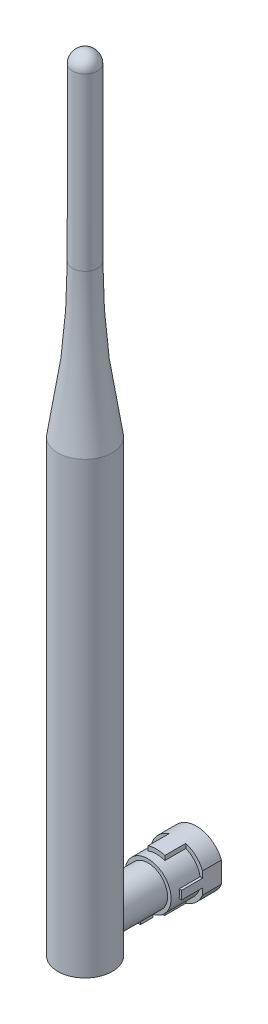
ISO-10303-21;
HEADER;
FILE_DESCRIPTION(('STEP AP214'),'2;1');
FILE_NAME('part.step','',(''),(''),'','','');
FILE_SCHEMA(('AUTOMOTIVE_DESIGN { 1 0 10303 214 1 1 1 1 }'));
ENDSEC;
DATA;
#1=APPLICATION_CONTEXT('core data for automotive mechanical design processes');
#2=APPLICATION_PROTOCOL_DEFINITION('international standard','automotive_design',2000,#1);
#3=PRODUCT_CONTEXT('',#1,'mechanical');
#4=PRODUCT('Part','Part','',(#3));
#5=PRODUCT_RELATED_PRODUCT_CATEGORY('part','',(#4));
#6=PRODUCT_DEFINITION_FORMATION('','',#4);
#7=PRODUCT_DEFINITION_CONTEXT('part definition',#1,'design');
#8=PRODUCT_DEFINITION('design','',#6,#7);
#9=PRODUCT_DEFINITION_SHAPE('','',#8);
#10=(LENGTH_UNIT() NAMED_UNIT(*) SI_UNIT(.MILLI.,.METRE.));
#11=(NAMED_UNIT(*) PLANE_ANGLE_UNIT() SI_UNIT($,.RADIAN.));
#12=(NAMED_UNIT(*) SI_UNIT($,.STERADIAN.) SOLID_ANGLE_UNIT());
#13=UNCERTAINTY_MEASURE_WITH_UNIT(LENGTH_MEASURE(1.E-05),#10,'distance_accuracy_value','');
#14=(GEOMETRIC_REPRESENTATION_CONTEXT(3) GLOBAL_UNCERTAINTY_ASSIGNED_CONTEXT((#13)) GLOBAL_UNIT_ASSIGNED_CONTEXT((#10,
#11,#12)) REPRESENTATION_CONTEXT('',''));
#15=CARTESIAN_POINT('',(0.,0.,0.));
#16=DIRECTION('',(0.,0.,1.));
#17=DIRECTION('',(1.,0.,0.));
#18=AXIS2_PLACEMENT_3D('',#15,#16,#17);
#19=CARTESIAN_POINT('',(0.,0.,9.5));
#20=DIRECTION('',(0.,0.,1.));
#21=DIRECTION('',(1.,0.,0.));
#22=AXIS2_PLACEMENT_3D('',#19,#20,#21);
#23=PLANE('',#22);
#24=CARTESIAN_POINT('',(0.,0.,9.5));
#25=DIRECTION('',(0.,0.,1.));
#26=DIRECTION('',(1.,0.,0.));
#27=AXIS2_PLACEMENT_3D('',#24,#25,#26);
#28=CIRCLE('',#27,5.5);
#29=CARTESIAN_POINT('',(2.,5.1234753829798,9.5));
#30=VERTEX_POINT('',#29);
#31=CARTESIAN_POINT('',(-2.,5.1234753829798,9.5));
#32=VERTEX_POINT('',#31);
#33=EDGE_CURVE('E252',#30,#32,#28,.T.);
#34=ORIENTED_EDGE('',*,*,#33,.F.);
#35=DIRECTION('',(0.,-1.,0.));
#36=VECTOR('',#35,1.);
#37=CARTESIAN_POINT('',(2.00000000000002,0.,9.5));
#38=LINE('',#37,#36);
#39=CARTESIAN_POINT('',(2.,6.18465843842649,9.5));
#40=VERTEX_POINT('',#39);
#41=EDGE_CURVE('E260',#40,#30,#38,.T.);
#42=ORIENTED_EDGE('',*,*,#41,.F.);
#43=CARTESIAN_POINT('',(0.,0.,9.5));
#44=DIRECTION('',(0.,0.,1.));
#45=DIRECTION('',(1.,0.,0.));
#46=AXIS2_PLACEMENT_3D('',#43,#44,#45);
#47=CIRCLE('',#46,6.5);
#48=CARTESIAN_POINT('',(-2.,6.18465843842649,9.5));
#49=VERTEX_POINT('',#48);
#50=EDGE_CURVE('E264',#40,#49,#47,.T.);
#51=ORIENTED_EDGE('',*,*,#50,.T.);
#52=DIRECTION('',(0.,-1.,0.));
#53=VECTOR('',#52,1.);
#54=CARTESIAN_POINT('',(-2.,0.,9.5));
#55=LINE('',#54,#53);
#56=EDGE_CURVE('E266',#49,#32,#55,.T.);
#57=ORIENTED_EDGE('',*,*,#56,.T.);
#58=EDGE_LOOP('',(#34,#42,#51,#57));
#59=FACE_BOUND('',#58,.T.);
#60=ADVANCED_FACE('F35',(#59),#23,.T.);
#61=CARTESIAN_POINT('',(-5.40832691319598,0.999999999999997,9.5));
#62=VERTEX_POINT('',#61);
#63=CARTESIAN_POINT('',(-5.40832691319598,-1.,9.5));
#64=VERTEX_POINT('',#63);
#65=EDGE_CURVE('E255',#62,#64,#28,.T.);
#66=ORIENTED_EDGE('',*,*,#65,.F.);
#67=DIRECTION('',(1.,0.,0.));
#68=VECTOR('',#67,1.);
#69=CARTESIAN_POINT('',(0.,0.999999999999997,9.5));
#70=LINE('',#69,#68);
#71=CARTESIAN_POINT('',(-6.,0.999999999999997,9.5));
#72=VERTEX_POINT('',#71);
#73=EDGE_CURVE('E268',#72,#62,#70,.T.);
#74=ORIENTED_EDGE('',*,*,#73,.F.);
#75=DIRECTION('',(0.,-1.,0.));
#76=VECTOR('',#75,1.);
#77=CARTESIAN_POINT('',(-6.,0.,9.5));
#78=LINE('',#77,#76);
#79=CARTESIAN_POINT('',(-6.,-1.,9.5));
#80=VERTEX_POINT('',#79);
#81=EDGE_CURVE('E271',#72,#80,#78,.T.);
#82=ORIENTED_EDGE('',*,*,#81,.T.);
#83=DIRECTION('',(1.,0.,0.));
#84=VECTOR('',#83,1.);
#85=CARTESIAN_POINT('',(0.,-0.999999999999996,9.5));
#86=LINE('',#85,#84);
#87=EDGE_CURVE('E273',#80,#64,#86,.T.);
#88=ORIENTED_EDGE('',*,*,#87,.T.);
#89=EDGE_LOOP('',(#66,#74,#82,#88));
#90=FACE_BOUND('',#89,.T.);
#91=ADVANCED_FACE('F431',(#90),#23,.T.);
#92=CARTESIAN_POINT('',(-2.,-5.1234753829798,9.5));
#93=VERTEX_POINT('',#92);
#94=CARTESIAN_POINT('',(2.,-5.1234753829798,9.5));
#95=VERTEX_POINT('',#94);
#96=EDGE_CURVE('E462',#93,#95,#28,.T.);
#97=ORIENTED_EDGE('',*,*,#96,.F.);
#98=DIRECTION('',(0.,-1.,0.));
#99=VECTOR('',#98,1.);
#100=CARTESIAN_POINT('',(-2.,0.,9.5));
#101=LINE('',#100,#99);
#102=CARTESIAN_POINT('',(-2.,-6.18465843842649,9.5));
#103=VERTEX_POINT('',#102);
#104=EDGE_CURVE('E275',#93,#103,#101,.T.);
#105=ORIENTED_EDGE('',*,*,#104,.T.);
#106=CARTESIAN_POINT('',(0.,0.,9.5));
#107=DIRECTION('',(0.,0.,1.));
#108=DIRECTION('',(1.,0.,0.));
#109=AXIS2_PLACEMENT_3D('',#106,#107,#108);
#110=CIRCLE('',#109,6.5);
#111=CARTESIAN_POINT('',(2.,-6.18465843842649,9.5));
#112=VERTEX_POINT('',#111);
#113=EDGE_CURVE('E277',#103,#112,#110,.T.);
#114=ORIENTED_EDGE('',*,*,#113,.T.);
#115=DIRECTION('',(0.,-1.,0.));
#116=VECTOR('',#115,1.);
#117=CARTESIAN_POINT('',(2.00000000000002,0.,9.5));
#118=LINE('',#117,#116);
#119=EDGE_CURVE('E279',#95,#112,#118,.T.);
#120=ORIENTED_EDGE('',*,*,#119,.F.);
#121=EDGE_LOOP('',(#97,#105,#114,#120));
#122=FACE_BOUND('',#121,.T.);
#123=ADVANCED_FACE('F438',(#122),#23,.T.);
#124=CARTESIAN_POINT('',(0.,0.,4.5));
#125=DIRECTION('',(0.,0.,1.));
#126=DIRECTION('',(1.,0.,0.));
#127=AXIS2_PLACEMENT_3D('',#124,#125,#126);
#128=PLANE('',#127);
#129=DIRECTION('',(1.,0.,0.));
#130=VECTOR('',#129,1.);
#131=CARTESIAN_POINT('',(0.,-0.999999999999997,4.5));
#132=LINE('',#131,#130);
#133=CARTESIAN_POINT('',(5.40832691319599,-0.999999999999999,4.5));
#134=VERTEX_POINT('',#133);
#135=CARTESIAN_POINT('',(6.,-0.999999999999999,4.5));
#136=VERTEX_POINT('',#135);
#137=EDGE_CURVE('E261',#134,#136,#132,.T.);
#138=ORIENTED_EDGE('',*,*,#137,.F.);
#139=CARTESIAN_POINT('',(0.,0.,4.5));
#140=DIRECTION('',(0.,0.,1.));
#141=DIRECTION('',(1.,0.,0.));
#142=AXIS2_PLACEMENT_3D('',#139,#140,#141);
#143=CIRCLE('',#142,5.5);
#144=CARTESIAN_POINT('',(2.,-5.1234753829798,4.5));
#145=VERTEX_POINT('',#144);
#146=EDGE_CURVE('E312',#145,#134,#143,.T.);
#147=ORIENTED_EDGE('',*,*,#146,.F.);
#148=DIRECTION('',(0.,-1.,0.));
#149=VECTOR('',#148,1.);
#150=CARTESIAN_POINT('',(2.00000000000002,0.,4.5));
#151=LINE('',#150,#149);
#152=CARTESIAN_POINT('',(2.,-6.18465843842649,4.5));
#153=VERTEX_POINT('',#152);
#154=EDGE_CURVE('E310',#145,#153,#151,.T.);
#155=ORIENTED_EDGE('',*,*,#154,.T.);
#156=CARTESIAN_POINT('',(0.,0.,4.5));
#157=DIRECTION('',(0.,0.,1.));
#158=DIRECTION('',(1.,0.,0.));
#159=AXIS2_PLACEMENT_3D('',#156,#157,#158);
#160=CIRCLE('',#159,6.5);
#161=CARTESIAN_POINT('',(6.,-2.5,4.5));
#162=VERTEX_POINT('',#161);
#163=EDGE_CURVE('E371',#153,#162,#160,.T.);
#164=ORIENTED_EDGE('',*,*,#163,.T.);
#165=DIRECTION('',(0.,1.,0.));
#166=VECTOR('',#165,1.);
#167=CARTESIAN_POINT('',(6.,2.5,4.5));
#168=LINE('',#167,#166);
#169=EDGE_CURVE('E375',#162,#136,#168,.T.);
#170=ORIENTED_EDGE('',*,*,#169,.T.);
#171=EDGE_LOOP('',(#138,#147,#155,#164,#170));
#172=FACE_BOUND('',#171,.T.);
#173=ADVANCED_FACE('F451',(#172),#128,.T.);
#174=DIRECTION('',(0.,-1.,0.));
#175=VECTOR('',#174,1.);
#176=CARTESIAN_POINT('',(-6.,2.5,4.5));
#177=LINE('',#176,#175);
#178=CARTESIAN_POINT('',(-6.,2.5,4.5));
#179=VERTEX_POINT('',#178);
#180=CARTESIAN_POINT('',(-6.,0.999999999999997,4.5));
#181=VERTEX_POINT('',#180);
#182=EDGE_CURVE('E369',#179,#181,#177,.T.);
#183=ORIENTED_EDGE('',*,*,#182,.T.);
#184=DIRECTION('',(1.,0.,0.));
#185=VECTOR('',#184,1.);
#186=CARTESIAN_POINT('',(0.,0.999999999999997,4.5));
#187=LINE('',#186,#185);
#188=CARTESIAN_POINT('',(-5.40832691319598,0.999999999999997,4.5));
#189=VERTEX_POINT('',#188);
#190=EDGE_CURVE('E299',#181,#189,#187,.T.);
#191=ORIENTED_EDGE('',*,*,#190,.T.);
#192=CARTESIAN_POINT('',(0.,0.,4.5));
#193=DIRECTION('',(0.,0.,1.));
#194=DIRECTION('',(1.,0.,0.));
#195=AXIS2_PLACEMENT_3D('',#192,#193,#194);
#196=CIRCLE('',#195,5.5);
#197=CARTESIAN_POINT('',(-2.,5.1234753829798,4.5));
#198=VERTEX_POINT('',#197);
#199=EDGE_CURVE('E296',#198,#189,#196,.T.);
#200=ORIENTED_EDGE('',*,*,#199,.F.);
#201=DIRECTION('',(0.,-1.,0.));
#202=VECTOR('',#201,1.);
#203=CARTESIAN_POINT('',(-2.,0.,4.5));
#204=LINE('',#203,#202);
#205=CARTESIAN_POINT('',(-2.,6.18465843842649,4.5));
#206=VERTEX_POINT('',#205);
#207=EDGE_CURVE('E293',#206,#198,#204,.T.);
#208=ORIENTED_EDGE('',*,*,#207,.F.);
#209=CARTESIAN_POINT('',(0.,0.,4.5));
#210=DIRECTION('',(0.,0.,1.));
#211=DIRECTION('',(1.,0.,0.));
#212=AXIS2_PLACEMENT_3D('',#209,#210,#211);
#213=CIRCLE('',#212,6.5);
#214=EDGE_CURVE('E368',#206,#179,#213,.T.);
#215=ORIENTED_EDGE('',*,*,#214,.T.);
#216=EDGE_LOOP('',(#183,#191,#200,#208,#215));
#217=FACE_BOUND('',#216,.T.);
#218=ADVANCED_FACE('F456',(#217),#128,.T.);
#219=CARTESIAN_POINT('',(0.,0.,4.5));
#220=DIRECTION('',(0.,0.,1.));
#221=DIRECTION('',(1.,0.,0.));
#222=AXIS2_PLACEMENT_3D('',#219,#220,#221);
#223=CIRCLE('',#222,5.5);
#224=CARTESIAN_POINT('',(5.40832691319599,0.999999999999999,4.5));
#225=VERTEX_POINT('',#224);
#226=CARTESIAN_POINT('',(2.,5.1234753829798,4.5));
#227=VERTEX_POINT('',#226);
#228=EDGE_CURVE('E288',#225,#227,#223,.T.);
#229=ORIENTED_EDGE('',*,*,#228,.F.);
#230=DIRECTION('',(1.,0.,0.));
#231=VECTOR('',#230,1.);
#232=CARTESIAN_POINT('',(0.,0.999999999999997,4.5));
#233=LINE('',#232,#231);
#234=CARTESIAN_POINT('',(6.,0.999999999999999,4.5));
#235=VERTEX_POINT('',#234);
#236=EDGE_CURVE('E251',#225,#235,#233,.T.);
#237=ORIENTED_EDGE('',*,*,#236,.T.);
#238=CARTESIAN_POINT('',(6.,2.5,4.5));
#239=VERTEX_POINT('',#238);
#240=EDGE_CURVE('E374',#235,#239,#168,.T.);
#241=ORIENTED_EDGE('',*,*,#240,.T.);
#242=CARTESIAN_POINT('',(2.,6.18465843842649,4.5));
#243=VERTEX_POINT('',#242);
#244=EDGE_CURVE('E365',#239,#243,#213,.T.);
#245=ORIENTED_EDGE('',*,*,#244,.T.);
#246=DIRECTION('',(0.,-1.,0.));
#247=VECTOR('',#246,1.);
#248=CARTESIAN_POINT('',(2.00000000000002,0.,4.5));
#249=LINE('',#248,#247);
#250=EDGE_CURVE('E291',#243,#227,#249,.T.);
#251=ORIENTED_EDGE('',*,*,#250,.T.);
#252=EDGE_LOOP('',(#229,#237,#241,#245,#251));
#253=FACE_BOUND('',#252,.T.);
#254=ADVANCED_FACE('F493',(#253),#128,.T.);
#255=CARTESIAN_POINT('',(0.,0.,4.5));
#256=DIRECTION('',(0.,0.,-1.));
#257=DIRECTION('',(-1.,0.,0.));
#258=AXIS2_PLACEMENT_3D('',#255,#256,#257);
#259=CYLINDRICAL_SURFACE('',#258,6.5);
#260=CARTESIAN_POINT('',(0.,0.,0.));
#261=DIRECTION('',(0.,0.,1.));
#262=DIRECTION('',(1.,0.,0.));
#263=AXIS2_PLACEMENT_3D('',#260,#261,#262);
#264=CIRCLE('',#263,6.5);
#265=CARTESIAN_POINT('',(6.,2.5,0.));
#266=VERTEX_POINT('',#265);
#267=CARTESIAN_POINT('',(-6.,2.5,0.));
#268=VERTEX_POINT('',#267);
#269=EDGE_CURVE('E364',#266,#268,#264,.T.);
#270=ORIENTED_EDGE('',*,*,#269,.T.);
#271=DIRECTION('',(0.,0.,-1.));
#272=VECTOR('',#271,1.);
#273=CARTESIAN_POINT('',(-6.,2.5,4.5));
#274=LINE('',#273,#272);
#275=EDGE_CURVE('E394',#179,#268,#274,.T.);
#276=ORIENTED_EDGE('',*,*,#275,.F.);
#277=ORIENTED_EDGE('',*,*,#214,.F.);
#278=DIRECTION('',(0.,0.,-1.));
#279=VECTOR('',#278,1.);
#280=CARTESIAN_POINT('',(-2.,6.18465843842649,9.5));
#281=LINE('',#280,#279);
#282=EDGE_CURVE('E352',#49,#206,#281,.T.);
#283=ORIENTED_EDGE('',*,*,#282,.F.);
#284=ORIENTED_EDGE('',*,*,#50,.F.);
#285=DIRECTION('',(0.,0.,-1.));
#286=VECTOR('',#285,1.);
#287=CARTESIAN_POINT('',(2.,6.18465843842649,9.5));
#288=LINE('',#287,#286);
#289=EDGE_CURVE('E355',#40,#243,#288,.T.);
#290=ORIENTED_EDGE('',*,*,#289,.T.);
#291=ORIENTED_EDGE('',*,*,#244,.F.);
#292=DIRECTION('',(0.,0.,-1.));
#293=VECTOR('',#292,1.);
#294=CARTESIAN_POINT('',(6.,2.5,4.5));
#295=LINE('',#294,#293);
#296=EDGE_CURVE('E377',#239,#266,#295,.T.);
#297=ORIENTED_EDGE('',*,*,#296,.T.);
#298=EDGE_LOOP('',(#270,#276,#277,#283,#284,#290,#291,#297));
#299=FACE_BOUND('',#298,.T.);
#300=ADVANCED_FACE('F501',(#299),#259,.T.);
#301=CARTESIAN_POINT('',(-6.,2.5,4.5));
#302=DIRECTION('',(1.,0.,0.));
#303=DIRECTION('',(0.,0.,-1.));
#304=AXIS2_PLACEMENT_3D('',#301,#302,#303);
#305=PLANE('',#304);
#306=DIRECTION('',(0.,-1.,0.));
#307=VECTOR('',#306,1.);
#308=CARTESIAN_POINT('',(-6.,2.5,0.));
#309=LINE('',#308,#307);
#310=CARTESIAN_POINT('',(-6.,-2.5,0.));
#311=VERTEX_POINT('',#310);
#312=EDGE_CURVE('E380',#268,#311,#309,.T.);
#313=ORIENTED_EDGE('',*,*,#312,.T.);
#314=DIRECTION('',(0.,0.,-1.));
#315=VECTOR('',#314,1.);
#316=CARTESIAN_POINT('',(-6.,-2.5,4.5));
#317=LINE('',#316,#315);
#318=CARTESIAN_POINT('',(-6.,-2.5,4.5));
#319=VERTEX_POINT('',#318);
#320=EDGE_CURVE('E391',#319,#311,#317,.T.);
#321=ORIENTED_EDGE('',*,*,#320,.F.);
#322=CARTESIAN_POINT('',(-6.,-1.,4.5));
#323=VERTEX_POINT('',#322);
#324=EDGE_CURVE('E367',#323,#319,#177,.T.);
#325=ORIENTED_EDGE('',*,*,#324,.F.);
#326=DIRECTION('',(0.,0.,-1.));
#327=VECTOR('',#326,1.);
#328=CARTESIAN_POINT('',(-6.,-1.,9.5));
#329=LINE('',#328,#327);
#330=EDGE_CURVE('E340',#80,#323,#329,.T.);
#331=ORIENTED_EDGE('',*,*,#330,.F.);
#332=ORIENTED_EDGE('',*,*,#81,.F.);
#333=DIRECTION('',(0.,0.,-1.));
#334=VECTOR('',#333,1.);
#335=CARTESIAN_POINT('',(-6.,0.999999999999997,9.5));
#336=LINE('',#335,#334);
#337=EDGE_CURVE('E343',#72,#181,#336,.T.);
#338=ORIENTED_EDGE('',*,*,#337,.T.);
#339=ORIENTED_EDGE('',*,*,#182,.F.);
#340=ORIENTED_EDGE('',*,*,#275,.T.);
#341=EDGE_LOOP('',(#313,#321,#325,#331,#332,#338,#339,#340));
#342=FACE_BOUND('',#341,.T.);
#343=ADVANCED_FACE('F517',(#342),#305,.F.);
#344=CARTESIAN_POINT('',(0.,0.,4.5));
#345=DIRECTION('',(0.,0.,-1.));
#346=DIRECTION('',(-1.,0.,0.));
#347=AXIS2_PLACEMENT_3D('',#344,#345,#346);
#348=CYLINDRICAL_SURFACE('',#347,6.5);
#349=CARTESIAN_POINT('',(0.,0.,0.));
#350=DIRECTION('',(0.,0.,1.));
#351=DIRECTION('',(1.,0.,0.));
#352=AXIS2_PLACEMENT_3D('',#349,#350,#351);
#353=CIRCLE('',#352,6.5);
#354=CARTESIAN_POINT('',(6.,-2.5,0.));
#355=VERTEX_POINT('',#354);
#356=EDGE_CURVE('E382',#311,#355,#353,.T.);
#357=ORIENTED_EDGE('',*,*,#356,.T.);
#358=DIRECTION('',(0.,0.,-1.));
#359=VECTOR('',#358,1.);
#360=CARTESIAN_POINT('',(6.,-2.5,4.5));
#361=LINE('',#360,#359);
#362=EDGE_CURVE('E388',#162,#355,#361,.T.);
#363=ORIENTED_EDGE('',*,*,#362,.F.);
#364=ORIENTED_EDGE('',*,*,#163,.F.);
#365=DIRECTION('',(0.,0.,-1.));
#366=VECTOR('',#365,1.);
#367=CARTESIAN_POINT('',(2.,-6.18465843842649,9.5));
#368=LINE('',#367,#366);
#369=EDGE_CURVE('E328',#112,#153,#368,.T.);
#370=ORIENTED_EDGE('',*,*,#369,.F.);
#371=ORIENTED_EDGE('',*,*,#113,.F.);
#372=DIRECTION('',(0.,0.,-1.));
#373=VECTOR('',#372,1.);
#374=CARTESIAN_POINT('',(-2.,-6.18465843842649,9.5));
#375=LINE('',#374,#373);
#376=CARTESIAN_POINT('',(-2.,-6.18465843842649,4.5));
#377=VERTEX_POINT('',#376);
#378=EDGE_CURVE('E331',#103,#377,#375,.T.);
#379=ORIENTED_EDGE('',*,*,#378,.T.);
#380=EDGE_CURVE('E372',#319,#377,#160,.T.);
#381=ORIENTED_EDGE('',*,*,#380,.F.);
#382=ORIENTED_EDGE('',*,*,#320,.T.);
#383=EDGE_LOOP('',(#357,#363,#364,#370,#371,#379,#381,#382));
#384=FACE_BOUND('',#383,.T.);
#385=ADVANCED_FACE('F475',(#384),#348,.T.);
#386=CARTESIAN_POINT('',(6.,2.5,4.5));
#387=DIRECTION('',(-1.,0.,0.));
#388=DIRECTION('',(0.,0.,1.));
#389=AXIS2_PLACEMENT_3D('',#386,#387,#388);
#390=PLANE('',#389);
#391=DIRECTION('',(0.,1.,0.));
#392=VECTOR('',#391,1.);
#393=CARTESIAN_POINT('',(6.,2.5,0.));
#394=LINE('',#393,#392);
#395=EDGE_CURVE('E384',#355,#266,#394,.T.);
#396=ORIENTED_EDGE('',*,*,#395,.T.);
#397=ORIENTED_EDGE('',*,*,#296,.F.);
#398=ORIENTED_EDGE('',*,*,#240,.F.);
#399=DIRECTION('',(0.,0.,-1.));
#400=VECTOR('',#399,1.);
#401=CARTESIAN_POINT('',(6.,0.999999999999999,9.5));
#402=LINE('',#401,#400);
#403=CARTESIAN_POINT('',(6.,0.999999999999999,9.5));
#404=VERTEX_POINT('',#403);
#405=EDGE_CURVE('E286',#404,#235,#402,.T.);
#406=ORIENTED_EDGE('',*,*,#405,.F.);
#407=DIRECTION('',(0.,1.,0.));
#408=VECTOR('',#407,1.);
#409=CARTESIAN_POINT('',(6.,0.,9.5));
#410=LINE('',#409,#408);
#411=CARTESIAN_POINT('',(6.,-0.999999999999999,9.5));
#412=VERTEX_POINT('',#411);
#413=EDGE_CURVE('E284',#412,#404,#410,.T.);
#414=ORIENTED_EDGE('',*,*,#413,.F.);
#415=DIRECTION('',(0.,0.,-1.));
#416=VECTOR('',#415,1.);
#417=CARTESIAN_POINT('',(6.,-0.999999999999999,9.5));
#418=LINE('',#417,#416);
#419=EDGE_CURVE('E319',#412,#136,#418,.T.);
#420=ORIENTED_EDGE('',*,*,#419,.T.);
#421=ORIENTED_EDGE('',*,*,#169,.F.);
#422=ORIENTED_EDGE('',*,*,#362,.T.);
#423=EDGE_LOOP('',(#396,#397,#398,#406,#414,#420,#421,#422));
#424=FACE_BOUND('',#423,.T.);
#425=ADVANCED_FACE('F496',(#424),#390,.F.);
#426=DIRECTION('',(0.,-1.,0.));
#427=VECTOR('',#426,1.);
#428=CARTESIAN_POINT('',(-2.,0.,4.5));
#429=LINE('',#428,#427);
#430=CARTESIAN_POINT('',(-2.,-5.1234753829798,4.5));
#431=VERTEX_POINT('',#430);
#432=EDGE_CURVE('E307',#431,#377,#429,.T.);
#433=ORIENTED_EDGE('',*,*,#432,.F.);
#434=CARTESIAN_POINT('',(0.,0.,4.5));
#435=DIRECTION('',(0.,0.,1.));
#436=DIRECTION('',(1.,0.,0.));
#437=AXIS2_PLACEMENT_3D('',#434,#435,#436);
#438=CIRCLE('',#437,5.5);
#439=CARTESIAN_POINT('',(-5.40832691319598,-1.,4.5));
#440=VERTEX_POINT('',#439);
#441=EDGE_CURVE('E304',#440,#431,#438,.T.);
#442=ORIENTED_EDGE('',*,*,#441,.F.);
#443=DIRECTION('',(1.,0.,0.));
#444=VECTOR('',#443,1.);
#445=CARTESIAN_POINT('',(0.,-0.999999999999996,4.5));
#446=LINE('',#445,#444);
#447=EDGE_CURVE('E301',#323,#440,#446,.T.);
#448=ORIENTED_EDGE('',*,*,#447,.F.);
#449=ORIENTED_EDGE('',*,*,#324,.T.);
#450=ORIENTED_EDGE('',*,*,#380,.T.);
#451=EDGE_LOOP('',(#433,#442,#448,#449,#450));
#452=FACE_BOUND('',#451,.T.);
#453=ADVANCED_FACE('F459',(#452),#128,.T.);
#454=CARTESIAN_POINT('',(0.,0.,0.));
#455=DIRECTION('',(0.,0.,1.));
#456=DIRECTION('',(1.,0.,0.));
#457=AXIS2_PLACEMENT_3D('',#454,#455,#456);
#458=PLANE('',#457);
#459=ORIENTED_EDGE('',*,*,#269,.F.);
#460=ORIENTED_EDGE('',*,*,#395,.F.);
#461=ORIENTED_EDGE('',*,*,#356,.F.);
#462=ORIENTED_EDGE('',*,*,#312,.F.);
#463=EDGE_LOOP('',(#459,#460,#461,#462));
#464=FACE_BOUND('',#463,.T.);
#465=ADVANCED_FACE('F535',(#464),#458,.F.);
#466=CARTESIAN_POINT('',(0.,0.999999999999997,9.5));
#467=DIRECTION('',(0.,1.,0.));
#468=DIRECTION('',(-1.,0.,0.));
#469=AXIS2_PLACEMENT_3D('',#466,#467,#468);
#470=PLANE('',#469);
#471=ORIENTED_EDGE('',*,*,#236,.F.);
#472=DIRECTION('',(0.,0.,-1.));
#473=VECTOR('',#472,1.);
#474=CARTESIAN_POINT('',(5.40832691319599,0.999999999999999,9.5));
#475=LINE('',#474,#473);
#476=CARTESIAN_POINT('',(5.40832691319598,0.999999999999999,9.5));
#477=VERTEX_POINT('',#476);
#478=EDGE_CURVE('E361',#477,#225,#475,.T.);
#479=ORIENTED_EDGE('',*,*,#478,.F.);
#480=DIRECTION('',(1.,0.,0.));
#481=VECTOR('',#480,1.);
#482=CARTESIAN_POINT('',(0.,0.999999999999997,9.5));
#483=LINE('',#482,#481);
#484=EDGE_CURVE('E257',#477,#404,#483,.T.);
#485=ORIENTED_EDGE('',*,*,#484,.T.);
#486=ORIENTED_EDGE('',*,*,#405,.T.);
#487=EDGE_LOOP('',(#471,#479,#485,#486));
#488=FACE_BOUND('',#487,.T.);
#489=ADVANCED_FACE('F490',(#488),#470,.T.);
#490=CARTESIAN_POINT('',(0.,0.,9.5));
#491=DIRECTION('',(0.,0.,-1.));
#492=DIRECTION('',(-1.,0.,0.));
#493=AXIS2_PLACEMENT_3D('',#490,#491,#492);
#494=CYLINDRICAL_SURFACE('',#493,5.5);
#495=ORIENTED_EDGE('',*,*,#228,.T.);
#496=DIRECTION('',(0.,0.,-1.));
#497=VECTOR('',#496,1.);
#498=CARTESIAN_POINT('',(2.,5.1234753829798,9.5));
#499=LINE('',#498,#497);
#500=EDGE_CURVE('E358',#30,#227,#499,.T.);
#501=ORIENTED_EDGE('',*,*,#500,.F.);
#502=ORIENTED_EDGE('',*,*,#33,.T.);
#503=DIRECTION('',(0.,0.,-1.));
#504=VECTOR('',#503,1.);
#505=CARTESIAN_POINT('',(-2.,5.1234753829798,9.5));
#506=LINE('',#505,#504);
#507=EDGE_CURVE('E349',#32,#198,#506,.T.);
#508=ORIENTED_EDGE('',*,*,#507,.T.);
#509=ORIENTED_EDGE('',*,*,#199,.T.);
#510=DIRECTION('',(0.,0.,-1.));
#511=VECTOR('',#510,1.);
#512=CARTESIAN_POINT('',(-5.40832691319598,0.999999999999997,9.5));
#513=LINE('',#512,#511);
#514=EDGE_CURVE('E346',#62,#189,#513,.T.);
#515=ORIENTED_EDGE('',*,*,#514,.F.);
#516=ORIENTED_EDGE('',*,*,#65,.T.);
#517=DIRECTION('',(0.,0.,-1.));
#518=VECTOR('',#517,1.);
#519=CARTESIAN_POINT('',(-5.40832691319598,-1.,9.5));
#520=LINE('',#519,#518);
#521=EDGE_CURVE('E337',#64,#440,#520,.T.);
#522=ORIENTED_EDGE('',*,*,#521,.T.);
#523=ORIENTED_EDGE('',*,*,#441,.T.);
#524=DIRECTION('',(0.,0.,-1.));
#525=VECTOR('',#524,1.);
#526=CARTESIAN_POINT('',(-2.,-5.1234753829798,9.5));
#527=LINE('',#526,#525);
#528=EDGE_CURVE('E334',#93,#431,#527,.T.);
#529=ORIENTED_EDGE('',*,*,#528,.F.);
#530=ORIENTED_EDGE('',*,*,#96,.T.);
#531=DIRECTION('',(0.,0.,-1.));
#532=VECTOR('',#531,1.);
#533=CARTESIAN_POINT('',(2.,-5.1234753829798,9.5));
#534=LINE('',#533,#532);
#535=EDGE_CURVE('E325',#95,#145,#534,.T.);
#536=ORIENTED_EDGE('',*,*,#535,.T.);
#537=ORIENTED_EDGE('',*,*,#146,.T.);
#538=DIRECTION('',(0.,0.,-1.));
#539=VECTOR('',#538,1.);
#540=CARTESIAN_POINT('',(5.40832691319599,-0.999999999999999,9.5));
#541=LINE('',#540,#539);
#542=CARTESIAN_POINT('',(5.40832691319599,-0.999999999999999,9.5));
#543=VERTEX_POINT('',#542);
#544=EDGE_CURVE('E322',#543,#134,#541,.T.);
#545=ORIENTED_EDGE('',*,*,#544,.F.);
#546=EDGE_CURVE('E256',#543,#477,#28,.T.);
#547=ORIENTED_EDGE('',*,*,#546,.T.);
#548=ORIENTED_EDGE('',*,*,#478,.T.);
#549=EDGE_LOOP('',(#495,#501,#502,#508,#509,#515,#516,#522,#523,#529,#530,#536,#537,#545,#547,#548));
#550=FACE_BOUND('',#549,.T.);
#551=CARTESIAN_POINT('',(0.,0.,11.5));
#552=DIRECTION('',(0.,0.,1.));
#553=DIRECTION('',(1.,0.,0.));
#554=AXIS2_PLACEMENT_3D('',#551,#552,#553);
#555=CIRCLE('',#554,5.5);
#556=CARTESIAN_POINT('',(-1.2,-5.36749476012786,11.5));
#557=VERTEX_POINT('',#556);
#558=CARTESIAN_POINT('',(1.2,-5.36749476012786,11.5));
#559=VERTEX_POINT('',#558);
#560=EDGE_CURVE('E248',#557,#559,#555,.T.);
#561=ORIENTED_EDGE('',*,*,#560,.F.);
#562=EDGE_CURVE('E208',#559,#557,#555,.T.);
#563=ORIENTED_EDGE('',*,*,#562,.F.);
#564=EDGE_LOOP('',(#561,#563));
#565=FACE_BOUND('',#564,.T.);
#566=ADVANCED_FACE('F467',(#550,#565),#494,.T.);
#567=CARTESIAN_POINT('',(2.00000000000002,0.,9.5));
#568=DIRECTION('',(1.,0.,0.));
#569=DIRECTION('',(0.,1.,0.));
#570=AXIS2_PLACEMENT_3D('',#567,#568,#569);
#571=PLANE('',#570);
#572=ORIENTED_EDGE('',*,*,#250,.F.);
#573=ORIENTED_EDGE('',*,*,#289,.F.);
#574=ORIENTED_EDGE('',*,*,#41,.T.);
#575=ORIENTED_EDGE('',*,*,#500,.T.);
#576=EDGE_LOOP('',(#572,#573,#574,#575));
#577=FACE_BOUND('',#576,.T.);
#578=ADVANCED_FACE('F505',(#577),#571,.T.);
#579=CARTESIAN_POINT('',(-2.,0.,9.5));
#580=DIRECTION('',(1.,0.,0.));
#581=DIRECTION('',(0.,1.,0.));
#582=AXIS2_PLACEMENT_3D('',#579,#580,#581);
#583=PLANE('',#582);
#584=ORIENTED_EDGE('',*,*,#207,.T.);
#585=ORIENTED_EDGE('',*,*,#507,.F.);
#586=ORIENTED_EDGE('',*,*,#56,.F.);
#587=ORIENTED_EDGE('',*,*,#282,.T.);
#588=EDGE_LOOP('',(#584,#585,#586,#587));
#589=FACE_BOUND('',#588,.T.);
#590=ADVANCED_FACE('F511',(#589),#583,.F.);
#591=CARTESIAN_POINT('',(0.,0.999999999999997,9.5));
#592=DIRECTION('',(0.,1.,0.));
#593=DIRECTION('',(0.,0.,1.));
#594=AXIS2_PLACEMENT_3D('',#591,#592,#593);
#595=PLANE('',#594);
#596=ORIENTED_EDGE('',*,*,#190,.F.);
#597=ORIENTED_EDGE('',*,*,#337,.F.);
#598=ORIENTED_EDGE('',*,*,#73,.T.);
#599=ORIENTED_EDGE('',*,*,#514,.T.);
#600=EDGE_LOOP('',(#596,#597,#598,#599));
#601=FACE_BOUND('',#600,.T.);
#602=ADVANCED_FACE('F523',(#601),#595,.T.);
#603=CARTESIAN_POINT('',(0.,-0.999999999999996,9.5));
#604=DIRECTION('',(0.,1.,0.));
#605=DIRECTION('',(-1.,0.,0.));
#606=AXIS2_PLACEMENT_3D('',#603,#604,#605);
#607=PLANE('',#606);
#608=ORIENTED_EDGE('',*,*,#447,.T.);
#609=ORIENTED_EDGE('',*,*,#521,.F.);
#610=ORIENTED_EDGE('',*,*,#87,.F.);
#611=ORIENTED_EDGE('',*,*,#330,.T.);
#612=EDGE_LOOP('',(#608,#609,#610,#611));
#613=FACE_BOUND('',#612,.T.);
#614=ADVANCED_FACE('F530',(#613),#607,.F.);
#615=CARTESIAN_POINT('',(-2.,0.,9.5));
#616=DIRECTION('',(1.,0.,0.));
#617=DIRECTION('',(0.,1.,0.));
#618=AXIS2_PLACEMENT_3D('',#615,#616,#617);
#619=PLANE('',#618);
#620=ORIENTED_EDGE('',*,*,#432,.T.);
#621=ORIENTED_EDGE('',*,*,#378,.F.);
#622=ORIENTED_EDGE('',*,*,#104,.F.);
#623=ORIENTED_EDGE('',*,*,#528,.T.);
#624=EDGE_LOOP('',(#620,#621,#622,#623));
#625=FACE_BOUND('',#624,.T.);
#626=ADVANCED_FACE('F470',(#625),#619,.F.);
#627=CARTESIAN_POINT('',(2.00000000000002,0.,9.5));
#628=DIRECTION('',(1.,0.,0.));
#629=DIRECTION('',(0.,1.,0.));
#630=AXIS2_PLACEMENT_3D('',#627,#628,#629);
#631=PLANE('',#630);
#632=ORIENTED_EDGE('',*,*,#154,.F.);
#633=ORIENTED_EDGE('',*,*,#535,.F.);
#634=ORIENTED_EDGE('',*,*,#119,.T.);
#635=ORIENTED_EDGE('',*,*,#369,.T.);
#636=EDGE_LOOP('',(#632,#633,#634,#635));
#637=FACE_BOUND('',#636,.T.);
#638=ADVANCED_FACE('F448',(#637),#631,.T.);
#639=CARTESIAN_POINT('',(0.,-0.999999999999997,9.5));
#640=DIRECTION('',(0.,1.,0.));
#641=DIRECTION('',(-1.,0.,0.));
#642=AXIS2_PLACEMENT_3D('',#639,#640,#641);
#643=PLANE('',#642);
#644=ORIENTED_EDGE('',*,*,#137,.T.);
#645=ORIENTED_EDGE('',*,*,#419,.F.);
#646=DIRECTION('',(1.,0.,0.));
#647=VECTOR('',#646,1.);
#648=CARTESIAN_POINT('',(0.,-0.999999999999997,9.5));
#649=LINE('',#648,#647);
#650=EDGE_CURVE('E282',#543,#412,#649,.T.);
#651=ORIENTED_EDGE('',*,*,#650,.F.);
#652=ORIENTED_EDGE('',*,*,#544,.T.);
#653=EDGE_LOOP('',(#644,#645,#651,#652));
#654=FACE_BOUND('',#653,.T.);
#655=ADVANCED_FACE('F442',(#654),#643,.F.);
#656=ORIENTED_EDGE('',*,*,#546,.F.);
#657=ORIENTED_EDGE('',*,*,#650,.T.);
#658=ORIENTED_EDGE('',*,*,#413,.T.);
#659=ORIENTED_EDGE('',*,*,#484,.F.);
#660=EDGE_LOOP('',(#656,#657,#658,#659));
#661=FACE_BOUND('',#660,.T.);
#662=ADVANCED_FACE('F434',(#661),#23,.T.);
#663=CARTESIAN_POINT('',(0.,0.,11.5));
#664=DIRECTION('',(0.,0.,1.));
#665=DIRECTION('',(1.,0.,0.));
#666=AXIS2_PLACEMENT_3D('',#663,#664,#665);
#667=PLANE('',#666);
#668=DIRECTION('',(0.,1.,0.));
#669=VECTOR('',#668,1.);
#670=CARTESIAN_POINT('',(1.2,-5.99249373956158,11.5));
#671=LINE('',#670,#669);
#672=CARTESIAN_POINT('',(1.2,-4.49249373956158,11.5));
#673=VERTEX_POINT('',#672);
#674=EDGE_CURVE('E242',#559,#673,#671,.T.);
#675=ORIENTED_EDGE('',*,*,#674,.F.);
#676=ORIENTED_EDGE('',*,*,#562,.T.);
#677=DIRECTION('',(0.,-1.,0.));
#678=VECTOR('',#677,1.);
#679=CARTESIAN_POINT('',(-1.2,-4.49249373956158,11.5));
#680=LINE('',#679,#678);
#681=CARTESIAN_POINT('',(-1.2,-4.49249373956158,11.5));
#682=VERTEX_POINT('',#681);
#683=EDGE_CURVE('E55',#682,#557,#680,.T.);
#684=ORIENTED_EDGE('',*,*,#683,.F.);
#685=CARTESIAN_POINT('',(0.,0.,11.5));
#686=DIRECTION('',(0.,0.,1.));
#687=DIRECTION('',(1.,0.,0.));
#688=AXIS2_PLACEMENT_3D('',#685,#686,#687);
#689=CIRCLE('',#688,4.65);
#690=EDGE_CURVE('E50',#673,#682,#689,.T.);
#691=ORIENTED_EDGE('',*,*,#690,.F.);
#692=EDGE_LOOP('',(#675,#676,#684,#691));
#693=FACE_BOUND('',#692,.T.);
#694=ADVANCED_FACE('F417',(#693),#667,.T.);
#695=CARTESIAN_POINT('',(0.,0.,11.5));
#696=DIRECTION('',(0.,0.,1.));
#697=DIRECTION('',(1.,0.,0.));
#698=AXIS2_PLACEMENT_3D('',#695,#696,#697);
#699=PLANE('',#698);
#700=CARTESIAN_POINT('',(-1.2,-5.99249373956158,11.5));
#701=VERTEX_POINT('',#700);
#702=EDGE_CURVE('E226',#557,#701,#680,.T.);
#703=ORIENTED_EDGE('',*,*,#702,.F.);
#704=ORIENTED_EDGE('',*,*,#560,.T.);
#705=CARTESIAN_POINT('',(1.2,-5.99249373956158,11.5));
#706=VERTEX_POINT('',#705);
#707=EDGE_CURVE('E218',#706,#559,#671,.T.);
#708=ORIENTED_EDGE('',*,*,#707,.F.);
#709=DIRECTION('',(1.,0.,0.));
#710=VECTOR('',#709,1.);
#711=CARTESIAN_POINT('',(-1.2,-5.99249373956158,11.5));
#712=LINE('',#711,#710);
#713=EDGE_CURVE('E238',#701,#706,#712,.T.);
#714=ORIENTED_EDGE('',*,*,#713,.F.);
#715=EDGE_LOOP('',(#703,#704,#708,#714));
#716=FACE_BOUND('',#715,.T.);
#717=ADVANCED_FACE('F414',(#716),#699,.F.);
#718=CARTESIAN_POINT('',(0.,0.,14.5));
#719=DIRECTION('',(0.,0.,-1.));
#720=DIRECTION('',(-1.,0.,0.));
#721=AXIS2_PLACEMENT_3D('',#718,#719,#720);
#722=CYLINDRICAL_SURFACE('',#721,4.65);
#723=CARTESIAN_POINT('',(-4.65,0.,21.9582492362526));
#724=CARTESIAN_POINT('',(-4.64999864053582,0.110608830189415,21.9582466162992));
#725=CARTESIAN_POINT('',(-4.64604311702212,0.221240891186341,21.9541871275837));
#726=CARTESIAN_POINT('',(-4.63031816899664,0.441421397911028,21.9381720513283));
#727=CARTESIAN_POINT('',(-4.6185435279257,0.550969070631841,21.9262111923818));
#728=CARTESIAN_POINT('',(-4.58742132039626,0.76820160761671,21.8949974277468));
#729=CARTESIAN_POINT('',(-4.56805493306057,0.875881142324598,21.8757264031224));
#730=CARTESIAN_POINT('',(-4.5221446305486,1.08836729271647,21.8308204225343));
#731=CARTESIAN_POINT('',(-4.49559652219093,1.19317219049181,21.8051817494193));
#732=CARTESIAN_POINT('',(-4.40659703611433,1.49975016387691,21.7210366075566));
#733=CARTESIAN_POINT('',(-4.33434686203314,1.69664315454542,21.654823967685));
#734=CARTESIAN_POINT('',(-4.16659850242632,2.07481914505756,21.5098352699882));
#735=CARTESIAN_POINT('',(-4.07110325633143,2.25610411467622,21.4310608010898));
#736=CARTESIAN_POINT('',(-3.83898165613585,2.63490336881426,21.2523917276846));
#737=CARTESIAN_POINT('',(-3.69801425703768,2.82921459120957,21.1512861133166));
#738=CARTESIAN_POINT('',(-3.46544559780843,3.10282751147181,21.0000623313022));
#739=CARTESIAN_POINT('',(-3.38431780990479,3.19112995664794,20.9496801897973));
#740=CARTESIAN_POINT('',(-3.21510883925802,3.36154643563513,20.849981962798));
#741=CARTESIAN_POINT('',(-3.12702606276761,3.44365904255888,20.8006661249661));
#742=CARTESIAN_POINT('',(-2.92780707286809,3.6153393103794,20.6954503870891));
#743=CARTESIAN_POINT('',(-2.81535866252125,3.70363100397611,20.6399417075882));
#744=CARTESIAN_POINT('',(-2.58148701904531,3.8702752995739,20.5332219998199));
#745=CARTESIAN_POINT('',(-2.46006789526831,3.94863240832885,20.4820090264299));
#746=CARTESIAN_POINT('',(-2.20888414252553,4.09443211651559,20.3853537109529));
#747=CARTESIAN_POINT('',(-2.07913129692832,4.16188967229824,20.3399034800086));
#748=CARTESIAN_POINT('',(-1.81201720248702,4.2849418840704,20.2561067047618));
#749=CARTESIAN_POINT('',(-1.67465950914498,4.34054202575033,20.2177568766304));
#750=CARTESIAN_POINT('',(-1.33123839499537,4.46052759857146,20.1343751849794));
#751=CARTESIAN_POINT('',(-1.12156469036435,4.51799300251409,20.0938421593855));
#752=CARTESIAN_POINT('',(-0.693502546566264,4.60316542004266,20.0334918007438));
#753=CARTESIAN_POINT('',(-0.475121432971845,4.63089692295003,20.0136574203174));
#754=CARTESIAN_POINT('',(-0.0352377188054059,4.65508894994882,19.9963643807245));
#755=CARTESIAN_POINT('',(0.18627054204151,4.65148270836246,19.9989534952132));
#756=CARTESIAN_POINT('',(0.625163178424951,4.61305048745476,20.0263952439133));
#757=CARTESIAN_POINT('',(0.842546429943849,4.57821612011516,20.0512538598139));
#758=CARTESIAN_POINT('',(1.26149689811179,4.48064869427923,20.1201440994861));
#759=CARTESIAN_POINT('',(1.46332939311478,4.41867129225819,20.1636557760617));
#760=CARTESIAN_POINT('',(1.85321697386549,4.26985678878764,20.2665184408581));
#761=CARTESIAN_POINT('',(2.04126933142448,4.18301478125957,20.325872554821));
#762=CARTESIAN_POINT('',(2.42104093723836,3.97653864852302,20.4639578538957));
#763=CARTESIAN_POINT('',(2.61083362733679,3.85432872060747,20.5441112761022));
#764=CARTESIAN_POINT('',(2.96829953139234,3.5863213418147,20.7139436827987));
#765=CARTESIAN_POINT('',(3.13594978573735,3.44049975115035,20.8036323832707));
#766=CARTESIAN_POINT('',(3.47675952047798,3.09890110709506,21.0038177511174));
#767=CARTESIAN_POINT('',(3.64520816833673,2.8988724884522,21.1150960015462));
#768=CARTESIAN_POINT('',(3.94747483897208,2.47152458726501,21.332597864022));
#769=CARTESIAN_POINT('',(4.08129399074355,2.24420619477887,21.4388216407633));
#770=CARTESIAN_POINT('',(4.28498411841854,1.81768822527581,21.6109776732035));
#771=CARTESIAN_POINT('',(4.36246707216536,1.62363538987038,21.6806014189092));
#772=CARTESIAN_POINT('',(4.49160312463463,1.22161359477696,21.8007095590868));
#773=CARTESIAN_POINT('',(4.54331339478531,1.01367660762751,21.8512362556941));
#774=CARTESIAN_POINT('',(4.61227507327254,0.619178878052784,21.9197202109248));
#775=CARTESIAN_POINT('',(4.63347503311007,0.433970183031679,21.9413738110758));
#776=CARTESIAN_POINT('',(4.65333711185427,0.0611260287927008,21.9616420658563));
#777=CARTESIAN_POINT('',(4.65201377675275,-0.1265077859905,21.9602715898993));
#778=CARTESIAN_POINT('',(4.62697789539587,-0.498242997620625,21.9347674692889));
#779=CARTESIAN_POINT('',(4.60330993432114,-0.682350684091052,21.9106791546028));
#780=CARTESIAN_POINT('',(4.53522056724426,-1.04312333550935,21.843388758394));
#781=CARTESIAN_POINT('',(4.49076861221423,-1.21977692606762,21.8001585464254));
#782=CARTESIAN_POINT('',(4.36080412719902,-1.63420613373563,21.6787848450014));
#783=CARTESIAN_POINT('',(4.26591060801967,-1.86699253311743,21.5935969113386));
#784=CARTESIAN_POINT('',(4.09911336293749,-2.1989062255747,21.4549470576123));
#785=CARTESIAN_POINT('',(4.03933934264707,-2.30680245467442,21.4068456987153));
#786=CARTESIAN_POINT('',(3.91195411325748,-2.51677841254002,21.3083629868805));
#787=CARTESIAN_POINT('',(3.84434372163929,-2.61885874635907,21.2579818720978));
#788=CARTESIAN_POINT('',(3.6264150265072,-2.92138786744566,21.102648718235));
#789=CARTESIAN_POINT('',(3.46389531182992,-3.11238153170887,20.9960300366615));
#790=CARTESIAN_POINT('',(3.10891851691101,-3.46698913820726,20.7879939377087));
#791=CARTESIAN_POINT('',(2.91649030610004,-3.63062917090038,20.6865716287154));
#792=CARTESIAN_POINT('',(2.51866770257354,-3.91585706554288,20.5041364959234));
#793=CARTESIAN_POINT('',(2.31535698952532,-4.03969030600581,20.4221599418638));
#794=CARTESIAN_POINT('',(1.9943119801448,-4.20233943852768,20.3124658823301));
#795=CARTESIAN_POINT('',(1.88457051277788,-4.25272106282558,20.2781020160322));
#796=CARTESIAN_POINT('',(1.66023676429035,-4.3452055120385,20.2145265018063));
#797=CARTESIAN_POINT('',(1.54564679780711,-4.38731223432716,20.1853124290623));
#798=CARTESIAN_POINT('',(1.31131286344762,-4.462986210546,20.1325039051847));
#799=CARTESIAN_POINT('',(1.19153399220185,-4.49647963142371,20.1089581456346));
#800=CARTESIAN_POINT('',(0.948672447970875,-4.55390800680258,20.0684244771246));
#801=CARTESIAN_POINT('',(0.82559147981201,-4.57784779608334,20.0514332512758));
#802=CARTESIAN_POINT('',(0.577197027278,-4.6157469539918,20.0244735716304));
#803=CARTESIAN_POINT('',(0.451884619874566,-4.62971101025133,20.0145018193909));
#804=CARTESIAN_POINT('',(0.200179437146102,-4.6474012811384,20.0018618460796));
#805=CARTESIAN_POINT('',(0.0737868095348951,-4.65112887376525,19.9991926419628));
#806=CARTESIAN_POINT('',(-0.162188539564957,-4.64846569095533,20.0010974230826));
#807=CARTESIAN_POINT('',(-0.271795833883152,-4.64334119867219,20.0047649593241));
#808=CARTESIAN_POINT('',(-0.49009057763191,-4.62539814909099,20.017580048472));
#809=CARTESIAN_POINT('',(-0.59877773151709,-4.61257720821366,20.0267292990558));
#810=CARTESIAN_POINT('',(-0.814381801827918,-4.57942910914862,20.0503074130393));
#811=CARTESIAN_POINT('',(-0.921299302127861,-4.55910448045237,20.0647344972675));
#812=CARTESIAN_POINT('',(-1.13271775438034,-4.51123255553663,20.0985597746192));
#813=CARTESIAN_POINT('',(-1.23721774897527,-4.48368244948427,20.1179599015857));
#814=CARTESIAN_POINT('',(-1.54465158253268,-4.39113216617057,20.1827557000667));
#815=CARTESIAN_POINT('',(-1.74321167927283,-4.31596448037848,20.234941026389));
#816=CARTESIAN_POINT('',(-2.1245784995691,-4.14158830848024,20.353765762237));
#817=CARTESIAN_POINT('',(-2.30738259258115,-4.04237581847223,20.4204075788398));
#818=CARTESIAN_POINT('',(-2.67941284050213,-3.80763578827966,20.5740710878848));
#819=CARTESIAN_POINT('',(-2.86602121903049,-3.66898160497298,20.6626370808409));
#820=CARTESIAN_POINT('',(-3.21486611111015,-3.36755231254475,20.8472450185388));
#821=CARTESIAN_POINT('',(-3.37706485515252,-3.20474058144391,20.9432982067924));
#822=CARTESIAN_POINT('',(-3.61454154416284,-2.92846475412386,21.0966531970651));
#823=CARTESIAN_POINT('',(-3.69825848133633,-2.82201400052961,21.1537548608927));
#824=CARTESIAN_POINT('',(-3.85641945476673,-2.60171546222447,21.2666968841348));
#825=CARTESIAN_POINT('',(-3.93086101520218,-2.4878657148306,21.3225369035437));
#826=CARTESIAN_POINT('',(-4.06996157658007,-2.25310864653229,21.431154597372));
#827=CARTESIAN_POINT('',(-4.13463054272418,-2.13220869158671,21.4839353570141));
#828=CARTESIAN_POINT('',(-4.2537049784403,-1.88348890491745,21.5845075048326));
#829=CARTESIAN_POINT('',(-4.30811018097399,-1.75566889326194,21.6322987631799));
#830=CARTESIAN_POINT('',(-4.42508131857367,-1.44187869507959,21.73795336095));
#831=CARTESIAN_POINT('',(-4.48250919341034,-1.25272689015119,21.7924394687136));
#832=CARTESIAN_POINT('',(-4.55056262439471,-0.961667973569212,21.8585162350397));
#833=CARTESIAN_POINT('',(-4.57021976952285,-0.86354682368022,21.8779193563482));
#834=CARTESIAN_POINT('',(-4.60325601641339,-0.665289997684028,21.9108189489091));
#835=CARTESIAN_POINT('',(-4.61663847899133,-0.565155430037733,21.9243185818983));
#836=CARTESIAN_POINT('',(-4.63447042553484,-0.387502868682515,21.9423907988012));
#837=CARTESIAN_POINT('',(-4.64028598258786,-0.310255328220418,21.9483214540184));
#838=CARTESIAN_POINT('',(-4.6480517986392,-0.155342419413538,21.9562521534819));
#839=CARTESIAN_POINT('',(-4.65000095470692,-0.0776769381802799,21.9582510761596));
#840=CARTESIAN_POINT('',(-4.65,0.,21.9582492362526));
#841=B_SPLINE_CURVE_WITH_KNOTS('',3,(#723,#724,#725,#726,#727,#728,#729,#730,#731,#732,#733,
#734,#735,#736,#737,#738,#739,#740,#741,#742,#743,#744,#745,#746,#747,#748,#749,#750,#751,#752,
#753,#754,#755,#756,#757,#758,#759,#760,#761,#762,#763,#764,#765,#766,#767,#768,#769,#770,#771,
#772,#773,#774,#775,#776,#777,#778,#779,#780,#781,#782,#783,#784,#785,#786,#787,#788,#789,#790,
#791,#792,#793,#794,#795,#796,#797,#798,#799,#800,#801,#802,#803,#804,#805,#806,#807,#808,#809,
#810,#811,#812,#813,#814,#815,#816,#817,#818,#819,#820,#821,#822,#823,#824,#825,#826,#827,#828,
#829,#830,#831,#832,#833,#834,#835,#836,#837,#838,#839,#840),.UNSPECIFIED.,.T.,.F.,(4,2,2,2,2,2,
2,2,2,2,2,2,2,2,2,2,2,2,2,2,2,2,2,2,2,2,2,2,2,2,2,2,2,2,2,2,2,2,2,2,2,2,2,2,2,2,2,2,2,2,2,2,2,2,
2,2,2,2,4),(0.,0.331724620773417,0.663670775747447,0.996445124263895,1.32941419020404,
1.98638794423882,2.64327866447808,3.42170718048429,3.81164742933307,4.20167729442034,
4.66115595161132,5.12042541804254,5.57905922292309,6.03748038385767,6.69785068329635,
7.35767667230436,8.01890877758447,8.68031854608455,9.32438159868163,9.96857182015884,
10.6845471974429,11.4012592405803,12.2504641835773,13.0996414372065,13.7581495551307,
14.4151903325935,14.9756288477509,15.5357054343107,16.0946668329724,16.654452407543,
17.4460944759885,17.8430050051306,18.2398741662399,19.0541338156584,19.8676123200603,
20.6195214822518,20.9957741393921,21.3718491593596,21.7510478299832,22.1300543565017,
22.5088826691713,22.8876599827103,23.2166207751424,23.5456834988649,23.874635396751,
24.2037154071291,24.8567632233416,25.5099198588252,26.2535481146189,26.9983154251796,
27.4388177722999,27.8794374493581,28.3196047459614,28.7597834930743,29.3722178009715,
29.6777132194397,29.98304482246,30.2159376716696,30.448896946409),.UNSPECIFIED.);
#842=CARTESIAN_POINT('',(-4.65,0.,21.9582492362526));
#843=VERTEX_POINT('',#842);
#844=EDGE_CURVE('E224',#843,#843,#841,.T.);
#845=ORIENTED_EDGE('',*,*,#844,.T.);
#846=EDGE_LOOP('',(#845));
#847=FACE_BOUND('',#846,.T.);
#848=ORIENTED_EDGE('',*,*,#690,.T.);
#849=DIRECTION('',(0.,0.,-1.));
#850=VECTOR('',#849,1.);
#851=CARTESIAN_POINT('',(-1.2,-4.49249373956158,14.5));
#852=LINE('',#851,#850);
#853=CARTESIAN_POINT('',(-1.2,-4.49249373956158,14.5));
#854=VERTEX_POINT('',#853);
#855=EDGE_CURVE('E201',#854,#682,#852,.T.);
#856=ORIENTED_EDGE('',*,*,#855,.F.);
#857=CARTESIAN_POINT('',(0.,0.,14.5));
#858=DIRECTION('',(0.,0.,1.));
#859=DIRECTION('',(1.,0.,0.));
#860=AXIS2_PLACEMENT_3D('',#857,#858,#859);
#861=CIRCLE('',#860,4.65);
#862=CARTESIAN_POINT('',(1.2,-4.49249373956158,14.5));
#863=VERTEX_POINT('',#862);
#864=EDGE_CURVE('E206',#854,#863,#861,.T.);
#865=ORIENTED_EDGE('',*,*,#864,.T.);
#866=DIRECTION('',(0.,0.,-1.));
#867=VECTOR('',#866,1.);
#868=CARTESIAN_POINT('',(1.2,-4.49249373956158,14.5));
#869=LINE('',#868,#867);
#870=EDGE_CURVE('E235',#863,#673,#869,.T.);
#871=ORIENTED_EDGE('',*,*,#870,.T.);
#872=EDGE_LOOP('',(#848,#856,#865,#871));
#873=FACE_BOUND('',#872,.T.);
#874=ADVANCED_FACE('F203',(#847,#873),#722,.T.);
#875=CARTESIAN_POINT('',(-1.2,-4.49249373956158,14.5));
#876=DIRECTION('',(1.,0.,0.));
#877=DIRECTION('',(0.,0.,-1.));
#878=AXIS2_PLACEMENT_3D('',#875,#876,#877);
#879=PLANE('',#878);
#880=ORIENTED_EDGE('',*,*,#683,.T.);
#881=ORIENTED_EDGE('',*,*,#702,.T.);
#882=DIRECTION('',(0.,0.,-1.));
#883=VECTOR('',#882,1.);
#884=CARTESIAN_POINT('',(-1.2,-5.99249373956158,14.5));
#885=LINE('',#884,#883);
#886=CARTESIAN_POINT('',(-1.2,-5.99249373956158,14.5));
#887=VERTEX_POINT('',#886);
#888=EDGE_CURVE('E209',#887,#701,#885,.T.);
#889=ORIENTED_EDGE('',*,*,#888,.F.);
#890=DIRECTION('',(0.,-1.,0.));
#891=VECTOR('',#890,1.);
#892=CARTESIAN_POINT('',(-1.2,-4.49249373956158,14.5));
#893=LINE('',#892,#891);
#894=EDGE_CURVE('E212',#854,#887,#893,.T.);
#895=ORIENTED_EDGE('',*,*,#894,.F.);
#896=ORIENTED_EDGE('',*,*,#855,.T.);
#897=EDGE_LOOP('',(#880,#881,#889,#895,#896));
#898=FACE_BOUND('',#897,.T.);
#899=ADVANCED_FACE('F213',(#898),#879,.F.);
#900=CARTESIAN_POINT('',(-1.2,-5.99249373956158,14.5));
#901=DIRECTION('',(0.,1.,0.));
#902=DIRECTION('',(0.,0.,1.));
#903=AXIS2_PLACEMENT_3D('',#900,#901,#902);
#904=PLANE('',#903);
#905=ORIENTED_EDGE('',*,*,#713,.T.);
#906=DIRECTION('',(0.,0.,-1.));
#907=VECTOR('',#906,1.);
#908=CARTESIAN_POINT('',(1.2,-5.99249373956158,14.5));
#909=LINE('',#908,#907);
#910=CARTESIAN_POINT('',(1.2,-5.99249373956158,14.5));
#911=VERTEX_POINT('',#910);
#912=EDGE_CURVE('E244',#911,#706,#909,.T.);
#913=ORIENTED_EDGE('',*,*,#912,.F.);
#914=DIRECTION('',(1.,0.,0.));
#915=VECTOR('',#914,1.);
#916=CARTESIAN_POINT('',(-1.2,-5.99249373956158,14.5));
#917=LINE('',#916,#915);
#918=EDGE_CURVE('E217',#887,#911,#917,.T.);
#919=ORIENTED_EDGE('',*,*,#918,.F.);
#920=ORIENTED_EDGE('',*,*,#888,.T.);
#921=EDGE_LOOP('',(#905,#913,#919,#920));
#922=FACE_BOUND('',#921,.T.);
#923=ADVANCED_FACE('F421',(#922),#904,.F.);
#924=CARTESIAN_POINT('',(1.2,-5.99249373956158,14.5));
#925=DIRECTION('',(-1.,0.,0.));
#926=DIRECTION('',(0.,0.,1.));
#927=AXIS2_PLACEMENT_3D('',#924,#925,#926);
#928=PLANE('',#927);
#929=ORIENTED_EDGE('',*,*,#707,.T.);
#930=ORIENTED_EDGE('',*,*,#674,.T.);
#931=ORIENTED_EDGE('',*,*,#870,.F.);
#932=DIRECTION('',(0.,1.,0.));
#933=VECTOR('',#932,1.);
#934=CARTESIAN_POINT('',(1.2,-5.99249373956158,14.5));
#935=LINE('',#934,#933);
#936=EDGE_CURVE('E222',#911,#863,#935,.T.);
#937=ORIENTED_EDGE('',*,*,#936,.F.);
#938=ORIENTED_EDGE('',*,*,#912,.T.);
#939=EDGE_LOOP('',(#929,#930,#931,#937,#938));
#940=FACE_BOUND('',#939,.T.);
#941=ADVANCED_FACE('F413',(#940),#928,.F.);
#942=CARTESIAN_POINT('',(0.,0.,14.5));
#943=DIRECTION('',(0.,0.,1.));
#944=DIRECTION('',(1.,0.,0.));
#945=AXIS2_PLACEMENT_3D('',#942,#943,#944);
#946=PLANE('',#945);
#947=ORIENTED_EDGE('',*,*,#864,.F.);
#948=ORIENTED_EDGE('',*,*,#894,.T.);
#949=ORIENTED_EDGE('',*,*,#918,.T.);
#950=ORIENTED_EDGE('',*,*,#936,.T.);
#951=EDGE_LOOP('',(#947,#948,#949,#950));
#952=FACE_BOUND('',#951,.T.);
#953=ADVANCED_FACE('F220',(#952),#946,.T.);
#954=CARTESIAN_POINT('',(0.,-7.,26.5));
#955=DIRECTION('',(0.,1.,0.));
#956=DIRECTION('',(0.,0.,1.));
#957=AXIS2_PLACEMENT_3D('',#954,#955,#956);
#958=CYLINDRICAL_SURFACE('',#957,6.5);
#959=CARTESIAN_POINT('',(0.,-7.,26.5));
#960=DIRECTION('',(0.,1.,0.));
#961=DIRECTION('',(0.,0.,1.));
#962=AXIS2_PLACEMENT_3D('',#959,#960,#961);
#963=CIRCLE('',#962,6.5);
#964=CARTESIAN_POINT('',(0.,-7.,33.));
#965=VERTEX_POINT('',#964);
#966=EDGE_CURVE('E229',#965,#965,#963,.T.);
#967=ORIENTED_EDGE('',*,*,#966,.T.);
#968=EDGE_LOOP('',(#967));
#969=FACE_BOUND('',#968,.T.);
#970=CARTESIAN_POINT('',(0.,100.,26.5));
#971=DIRECTION('',(0.,1.,0.));
#972=DIRECTION('',(0.,0.,1.));
#973=AXIS2_PLACEMENT_3D('',#970,#971,#972);
#974=CIRCLE('',#973,6.5);
#975=CARTESIAN_POINT('',(0.,100.,33.));
#976=VERTEX_POINT('',#975);
#977=EDGE_CURVE('E564',#976,#976,#974,.T.);
#978=ORIENTED_EDGE('',*,*,#977,.F.);
#979=EDGE_LOOP('',(#978));
#980=FACE_BOUND('',#979,.T.);
#981=ORIENTED_EDGE('',*,*,#844,.F.);
#982=EDGE_LOOP('',(#981));
#983=FACE_BOUND('',#982,.T.);
#984=ADVANCED_FACE('F403',(#969,#980,#983),#958,.T.);
#985=CARTESIAN_POINT('',(0.,-7.,26.5));
#986=DIRECTION('',(0.,1.,0.));
#987=DIRECTION('',(0.,0.,1.));
#988=AXIS2_PLACEMENT_3D('',#985,#986,#987);
#989=PLANE('',#988);
#990=ORIENTED_EDGE('',*,*,#966,.F.);
#991=EDGE_LOOP('',(#990));
#992=FACE_BOUND('',#991,.T.);
#993=ADVANCED_FACE('F408',(#992),#989,.F.);
#994=CARTESIAN_POINT('',(0.,180.,26.5));
#995=DIRECTION('',(0.,-1.,0.));
#996=DIRECTION('',(0.,0.,-1.));
#997=AXIS2_PLACEMENT_3D('',#994,#995,#996);
#998=CYLINDRICAL_SURFACE('',#997,3.);
#999=CARTESIAN_POINT('',(0.,177.,26.5));
#1000=DIRECTION('',(0.,-1.,0.));
#1001=DIRECTION('',(0.,0.,-1.));
#1002=AXIS2_PLACEMENT_3D('',#999,#1000,#1001);
#1003=CIRCLE('',#1002,3.);
#1004=CARTESIAN_POINT('',(0.,177.,23.5));
#1005=VERTEX_POINT('',#1004);
#1006=EDGE_CURVE('E11',#1005,#1005,#1003,.T.);
#1007=ORIENTED_EDGE('',*,*,#1006,.T.);
#1008=EDGE_LOOP('',(#1007));
#1009=FACE_BOUND('',#1008,.T.);
#1010=CARTESIAN_POINT('',(0.,136.300826436873,26.5));
#1011=DIRECTION('',(0.,-1.,0.));
#1012=DIRECTION('',(0.,0.,-1.));
#1013=AXIS2_PLACEMENT_3D('',#1010,#1011,#1012);
#1014=CIRCLE('',#1013,3.);
#1015=CARTESIAN_POINT('',(0.,136.300826436873,23.5));
#1016=VERTEX_POINT('',#1015);
#1017=EDGE_CURVE('E43',#1016,#1016,#1014,.F.);
#1018=ORIENTED_EDGE('',*,*,#1017,.T.);
#1019=EDGE_LOOP('',(#1018));
#1020=FACE_BOUND('',#1019,.T.);
#1021=ADVANCED_FACE('F553',(#1009,#1020),#998,.T.);
#1022=CARTESIAN_POINT('',(0.,136.300826436873,26.5));
#1023=DIRECTION('',(0.,-1.,0.));
#1024=DIRECTION('',(0.,0.,-1.));
#1025=AXIS2_PLACEMENT_3D('',#1022,#1023,#1024);
#1026=TOROIDAL_SURFACE('',#1025,193.,190.);
#1027=ORIENTED_EDGE('',*,*,#977,.T.);
#1028=EDGE_LOOP('',(#1027));
#1029=FACE_BOUND('',#1028,.T.);
#1030=ORIENTED_EDGE('',*,*,#1017,.F.);
#1031=EDGE_LOOP('',(#1030));
#1032=FACE_BOUND('',#1031,.T.);
#1033=ADVANCED_FACE('F551',(#1029,#1032),#1026,.F.);
#1034=CARTESIAN_POINT('',(0.,177.,26.5));
#1035=DIRECTION('',(0.,1.,0.));
#1036=DIRECTION('',(0.,0.,1.));
#1037=AXIS2_PLACEMENT_3D('',#1034,#1035,#1036);
#1038=SPHERICAL_SURFACE('',#1037,3.);
#1039=ORIENTED_EDGE('',*,*,#1006,.F.);
#1040=EDGE_LOOP('',(#1039));
#1041=FACE_BOUND('',#1040,.T.);
#1042=ADVANCED_FACE('F37',(#1041),#1038,.T.);
#1043=CLOSED_SHELL('',(#60,#91,#123,#173,#218,#254,#300,#343,#385,#425,#453,#465,#489,#566,#578,
#590,#602,#614,#626,#638,#655,#662,#694,#717,#874,#899,#923,#941,#953,#984,#993,#1021,#1033,#1042));
#1044=MANIFOLD_SOLID_BREP('B2',#1043);
#1045=ADVANCED_BREP_SHAPE_REPRESENTATION('',(#18,#1044),#14);
#1046=SHAPE_DEFINITION_REPRESENTATION(#9,#1045);
ENDSEC;
END-ISO-10303-21;
